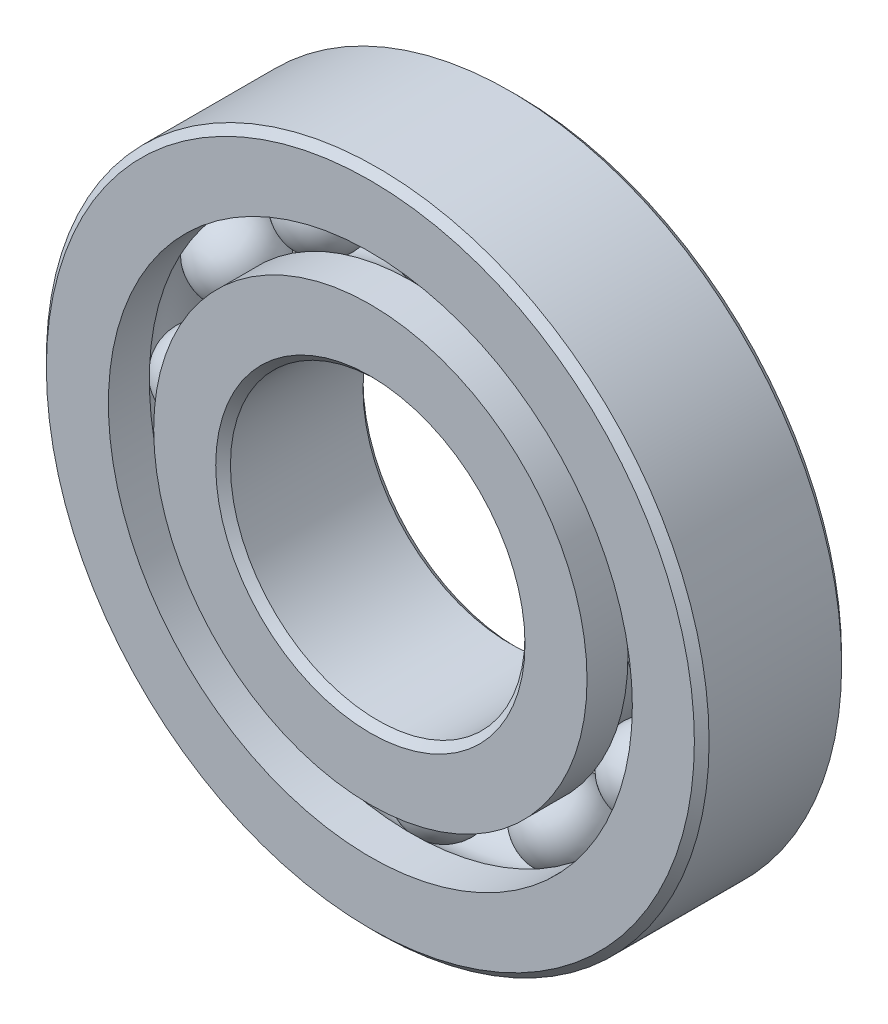
ISO-10303-21;
HEADER;
FILE_DESCRIPTION(('STEP AP214'),'2;1');
FILE_NAME('part.step','',(''),(''),'','','');
FILE_SCHEMA(('AUTOMOTIVE_DESIGN { 1 0 10303 214 1 1 1 1 }'));
ENDSEC;
DATA;
#1=APPLICATION_CONTEXT('core data for automotive mechanical design processes');
#2=APPLICATION_PROTOCOL_DEFINITION('international standard','automotive_design',2000,#1);
#3=PRODUCT_CONTEXT('',#1,'mechanical');
#4=PRODUCT('Part','Part','',(#3));
#5=PRODUCT_RELATED_PRODUCT_CATEGORY('part','',(#4));
#6=PRODUCT_DEFINITION_FORMATION('','',#4);
#7=PRODUCT_DEFINITION_CONTEXT('part definition',#1,'design');
#8=PRODUCT_DEFINITION('design','',#6,#7);
#9=PRODUCT_DEFINITION_SHAPE('','',#8);
#10=(LENGTH_UNIT() NAMED_UNIT(*) SI_UNIT(.MILLI.,.METRE.));
#11=(NAMED_UNIT(*) PLANE_ANGLE_UNIT() SI_UNIT($,.RADIAN.));
#12=(NAMED_UNIT(*) SI_UNIT($,.STERADIAN.) SOLID_ANGLE_UNIT());
#13=UNCERTAINTY_MEASURE_WITH_UNIT(LENGTH_MEASURE(1.E-05),#10,'distance_accuracy_value','');
#14=(GEOMETRIC_REPRESENTATION_CONTEXT(3) GLOBAL_UNCERTAINTY_ASSIGNED_CONTEXT((#13)) GLOBAL_UNIT_ASSIGNED_CONTEXT((#10,
#11,#12)) REPRESENTATION_CONTEXT('',''));
#15=CARTESIAN_POINT('',(0.,0.,0.));
#16=DIRECTION('',(0.,0.,1.));
#17=DIRECTION('',(1.,0.,0.));
#18=AXIS2_PLACEMENT_3D('',#15,#16,#17);
#19=CARTESIAN_POINT('',(-5.15937499999989,8.93629963530074,0.));
#20=DIRECTION('',(0.,0.,1.));
#21=DIRECTION('',(-0.499999999999989,0.866025403784445,0.));
#22=AXIS2_PLACEMENT_3D('',#19,#20,#21);
#23=SPHERICAL_SURFACE('',#22,1.71627890103156);
#24=CARTESIAN_POINT('',(-5.15937499999989,8.93629963530074,1.71627890103155));
#25=VERTEX_POINT('',#24);
#26=VERTEX_LOOP('',#25);
#27=FACE_BOUND('',#26,.T.);
#28=ADVANCED_FACE('F41',(#27),#23,.T.);
#29=CLOSED_SHELL('',(#28));
#30=MANIFOLD_SOLID_BREP('B2',#29);
#31=CARTESIAN_POINT('',(-8.93629963530062,5.1593750000001,0.));
#32=DIRECTION('',(0.,0.,1.));
#33=DIRECTION('',(-0.866025403784433,0.50000000000001,0.));
#34=AXIS2_PLACEMENT_3D('',#31,#32,#33);
#35=SPHERICAL_SURFACE('',#34,1.71627890103156);
#36=CARTESIAN_POINT('',(-8.93629963530062,5.1593750000001,1.71627890103155));
#37=VERTEX_POINT('',#36);
#38=VERTEX_LOOP('',#37);
#39=FACE_BOUND('',#38,.T.);
#40=ADVANCED_FACE('F61',(#39),#35,.T.);
#41=CLOSED_SHELL('',(#40));
#42=MANIFOLD_SOLID_BREP('B6',#41);
#43=CARTESIAN_POINT('',(-10.31875,1.08083231797342E-13,0.));
#44=DIRECTION('',(0.,0.,1.));
#45=DIRECTION('',(-1.,0.,0.));
#46=AXIS2_PLACEMENT_3D('',#43,#44,#45);
#47=SPHERICAL_SURFACE('',#46,1.71627890103156);
#48=CARTESIAN_POINT('',(-10.31875,1.08083231797342E-13,1.71627890103155));
#49=VERTEX_POINT('',#48);
#50=VERTEX_LOOP('',#49);
#51=FACE_BOUND('',#50,.T.);
#52=ADVANCED_FACE('F81',(#51),#47,.T.);
#53=CLOSED_SHELL('',(#52));
#54=MANIFOLD_SOLID_BREP('B37',#53);
#55=CARTESIAN_POINT('',(-8.93629963530072,-5.15937499999992,0.));
#56=DIRECTION('',(0.,0.,1.));
#57=DIRECTION('',(-0.866025403784443,-0.499999999999992,0.));
#58=AXIS2_PLACEMENT_3D('',#55,#56,#57);
#59=SPHERICAL_SURFACE('',#58,1.71627890103156);
#60=CARTESIAN_POINT('',(-8.93629963530072,-5.15937499999992,1.71627890103155));
#61=VERTEX_POINT('',#60);
#62=VERTEX_LOOP('',#61);
#63=FACE_BOUND('',#62,.T.);
#64=ADVANCED_FACE('F101',(#63),#59,.T.);
#65=CLOSED_SHELL('',(#64));
#66=MANIFOLD_SOLID_BREP('B57',#65);
#67=CARTESIAN_POINT('',(-5.15937500000007,-8.93629963530064,0.));
#68=DIRECTION('',(0.,0.,1.));
#69=DIRECTION('',(-0.500000000000007,-0.866025403784435,0.));
#70=AXIS2_PLACEMENT_3D('',#67,#68,#69);
#71=SPHERICAL_SURFACE('',#70,1.71627890103156);
#72=CARTESIAN_POINT('',(-5.15937500000007,-8.93629963530064,1.71627890103155));
#73=VERTEX_POINT('',#72);
#74=VERTEX_LOOP('',#73);
#75=FACE_BOUND('',#74,.T.);
#76=ADVANCED_FACE('F121',(#75),#71,.T.);
#77=CLOSED_SHELL('',(#76));
#78=MANIFOLD_SOLID_BREP('B77',#77);
#79=CARTESIAN_POINT('',(0.,-10.31875,0.));
#80=DIRECTION('',(0.,0.,1.));
#81=DIRECTION('',(0.,-1.,0.));
#82=AXIS2_PLACEMENT_3D('',#79,#80,#81);
#83=SPHERICAL_SURFACE('',#82,1.71627890103156);
#84=CARTESIAN_POINT('',(0.,-10.31875,1.71627890103155));
#85=VERTEX_POINT('',#84);
#86=VERTEX_LOOP('',#85);
#87=FACE_BOUND('',#86,.T.);
#88=ADVANCED_FACE('F141',(#87),#83,.T.);
#89=CLOSED_SHELL('',(#88));
#90=MANIFOLD_SOLID_BREP('B97',#89);
#91=CARTESIAN_POINT('',(5.15937499999995,-8.93629963530071,0.));
#92=DIRECTION('',(0.,0.,1.));
#93=DIRECTION('',(0.499999999999995,-0.866025403784442,0.));
#94=AXIS2_PLACEMENT_3D('',#91,#92,#93);
#95=SPHERICAL_SURFACE('',#94,1.71627890103156);
#96=CARTESIAN_POINT('',(5.15937499999995,-8.93629963530071,1.71627890103155));
#97=VERTEX_POINT('',#96);
#98=VERTEX_LOOP('',#97);
#99=FACE_BOUND('',#98,.T.);
#100=ADVANCED_FACE('F161',(#99),#95,.T.);
#101=CLOSED_SHELL('',(#100));
#102=MANIFOLD_SOLID_BREP('B117',#101);
#103=CARTESIAN_POINT('',(8.93629963530065,-5.15937500000004,0.));
#104=DIRECTION('',(0.,0.,1.));
#105=DIRECTION('',(0.866025403784436,-0.500000000000004,0.));
#106=AXIS2_PLACEMENT_3D('',#103,#104,#105);
#107=SPHERICAL_SURFACE('',#106,1.71627890103156);
#108=CARTESIAN_POINT('',(8.93629963530065,-5.15937500000004,1.71627890103155));
#109=VERTEX_POINT('',#108);
#110=VERTEX_LOOP('',#109);
#111=FACE_BOUND('',#110,.T.);
#112=ADVANCED_FACE('F181',(#111),#107,.T.);
#113=CLOSED_SHELL('',(#112));
#114=MANIFOLD_SOLID_BREP('B137',#113);
#115=CARTESIAN_POINT('',(10.31875,0.,0.));
#116=DIRECTION('',(0.,0.,1.));
#117=DIRECTION('',(1.,0.,0.));
#118=AXIS2_PLACEMENT_3D('',#115,#116,#117);
#119=SPHERICAL_SURFACE('',#118,1.71627890103156);
#120=CARTESIAN_POINT('',(10.31875,0.,1.71627890103155));
#121=VERTEX_POINT('',#120);
#122=VERTEX_LOOP('',#121);
#123=FACE_BOUND('',#122,.T.);
#124=ADVANCED_FACE('F201',(#123),#119,.T.);
#125=CLOSED_SHELL('',(#124));
#126=MANIFOLD_SOLID_BREP('B157',#125);
#127=CARTESIAN_POINT('',(8.93629963530069,5.15937499999998,0.));
#128=DIRECTION('',(0.,0.,1.));
#129=DIRECTION('',(0.86602540378444,0.499999999999998,0.));
#130=AXIS2_PLACEMENT_3D('',#127,#128,#129);
#131=SPHERICAL_SURFACE('',#130,1.71627890103156);
#132=CARTESIAN_POINT('',(8.93629963530069,5.15937499999998,1.71627890103155));
#133=VERTEX_POINT('',#132);
#134=VERTEX_LOOP('',#133);
#135=FACE_BOUND('',#134,.T.);
#136=ADVANCED_FACE('F221',(#135),#131,.T.);
#137=CLOSED_SHELL('',(#136));
#138=MANIFOLD_SOLID_BREP('B177',#137);
#139=CARTESIAN_POINT('',(5.15937500000001,8.93629963530067,0.));
#140=DIRECTION('',(0.,0.,1.));
#141=DIRECTION('',(0.500000000000001,0.866025403784438,0.));
#142=AXIS2_PLACEMENT_3D('',#139,#140,#141);
#143=SPHERICAL_SURFACE('',#142,1.71627890103156);
#144=CARTESIAN_POINT('',(5.15937500000001,8.93629963530067,1.71627890103155));
#145=VERTEX_POINT('',#144);
#146=VERTEX_LOOP('',#145);
#147=FACE_BOUND('',#146,.T.);
#148=ADVANCED_FACE('F241',(#147),#143,.T.);
#149=CLOSED_SHELL('',(#148));
#150=MANIFOLD_SOLID_BREP('B197',#149);
#151=CARTESIAN_POINT('',(0.,10.31875,0.));
#152=DIRECTION('',(0.,0.,1.));
#153=DIRECTION('',(0.,1.,0.));
#154=AXIS2_PLACEMENT_3D('',#151,#152,#153);
#155=SPHERICAL_SURFACE('',#154,1.71627890103156);
#156=CARTESIAN_POINT('',(0.,10.31875,1.71627890103155));
#157=VERTEX_POINT('',#156);
#158=VERTEX_LOOP('',#157);
#159=FACE_BOUND('',#158,.T.);
#160=ADVANCED_FACE('F263',(#159),#155,.T.);
#161=CLOSED_SHELL('',(#160));
#162=MANIFOLD_SOLID_BREP('B217',#161);
#163=CARTESIAN_POINT('',(0.,9.34182692307692,3.175));
#164=DIRECTION('',(0.,0.,-1.));
#165=DIRECTION('',(-1.,0.,0.));
#166=AXIS2_PLACEMENT_3D('',#163,#164,#165);
#167=PLANE('',#166);
#168=CARTESIAN_POINT('',(0.,0.,3.175));
#169=DIRECTION('',(0.,0.,1.));
#170=DIRECTION('',(1.,0.,0.));
#171=AXIS2_PLACEMENT_3D('',#168,#169,#170);
#172=CIRCLE('',#171,6.6675);
#173=CARTESIAN_POINT('',(6.6675,0.,3.175));
#174=VERTEX_POINT('',#173);
#175=EDGE_CURVE('E310',#174,#174,#172,.T.);
#176=ORIENTED_EDGE('',*,*,#175,.F.);
#177=EDGE_LOOP('',(#176));
#178=FACE_BOUND('',#177,.T.);
#179=CARTESIAN_POINT('',(0.,0.,3.175));
#180=DIRECTION('',(0.,0.,1.));
#181=DIRECTION('',(1.,0.,0.));
#182=AXIS2_PLACEMENT_3D('',#179,#180,#181);
#183=CIRCLE('',#182,9.34182692307692);
#184=CARTESIAN_POINT('',(9.34182692307692,0.,3.175));
#185=VERTEX_POINT('',#184);
#186=EDGE_CURVE('E262',#185,#185,#183,.T.);
#187=ORIENTED_EDGE('',*,*,#186,.T.);
#188=EDGE_LOOP('',(#187));
#189=FACE_BOUND('',#188,.T.);
#190=ADVANCED_FACE('F282',(#178,#189),#167,.F.);
#191=CARTESIAN_POINT('',(0.,0.,3.175));
#192=DIRECTION('',(0.,0.,1.));
#193=DIRECTION('',(1.,0.,0.));
#194=AXIS2_PLACEMENT_3D('',#191,#192,#193);
#195=CYLINDRICAL_SURFACE('',#194,9.34182692307692);
#196=ORIENTED_EDGE('',*,*,#186,.F.);
#197=EDGE_LOOP('',(#196));
#198=FACE_BOUND('',#197,.T.);
#199=CARTESIAN_POINT('',(0.,0.,1.41111111111111));
#200=DIRECTION('',(0.,0.,1.));
#201=DIRECTION('',(1.,0.,0.));
#202=AXIS2_PLACEMENT_3D('',#199,#200,#201);
#203=CIRCLE('',#202,9.34182692307692);
#204=CARTESIAN_POINT('',(9.34182692307692,0.,1.41111111111111));
#205=VERTEX_POINT('',#204);
#206=EDGE_CURVE('E288',#205,#205,#203,.T.);
#207=ORIENTED_EDGE('',*,*,#206,.T.);
#208=EDGE_LOOP('',(#207));
#209=FACE_BOUND('',#208,.T.);
#210=ADVANCED_FACE('F317',(#198,#209),#195,.T.);
#211=CARTESIAN_POINT('',(0.,0.,0.));
#212=DIRECTION('',(0.,0.,1.));
#213=DIRECTION('',(1.,0.,0.));
#214=AXIS2_PLACEMENT_3D('',#211,#212,#213);
#215=TOROIDAL_SURFACE('',#214,10.31875,1.71627890103155);
#216=ORIENTED_EDGE('',*,*,#206,.F.);
#217=EDGE_LOOP('',(#216));
#218=FACE_BOUND('',#217,.T.);
#219=CARTESIAN_POINT('',(0.,0.,-1.41111111111111));
#220=DIRECTION('',(0.,0.,1.));
#221=DIRECTION('',(1.,0.,0.));
#222=AXIS2_PLACEMENT_3D('',#219,#220,#221);
#223=CIRCLE('',#222,9.34182692307692);
#224=CARTESIAN_POINT('',(9.34182692307692,0.,-1.41111111111111));
#225=VERTEX_POINT('',#224);
#226=EDGE_CURVE('E292',#225,#225,#223,.T.);
#227=ORIENTED_EDGE('',*,*,#226,.T.);
#228=EDGE_LOOP('',(#227));
#229=FACE_BOUND('',#228,.T.);
#230=ADVANCED_FACE('F321',(#218,#229),#215,.F.);
#231=CARTESIAN_POINT('',(0.,0.,3.175));
#232=DIRECTION('',(0.,0.,1.));
#233=DIRECTION('',(1.,0.,0.));
#234=AXIS2_PLACEMENT_3D('',#231,#232,#233);
#235=CYLINDRICAL_SURFACE('',#234,9.34182692307692);
#236=ORIENTED_EDGE('',*,*,#226,.F.);
#237=EDGE_LOOP('',(#236));
#238=FACE_BOUND('',#237,.T.);
#239=CARTESIAN_POINT('',(0.,0.,-3.175));
#240=DIRECTION('',(0.,0.,1.));
#241=DIRECTION('',(1.,0.,0.));
#242=AXIS2_PLACEMENT_3D('',#239,#240,#241);
#243=CIRCLE('',#242,9.34182692307692);
#244=CARTESIAN_POINT('',(9.34182692307692,0.,-3.175));
#245=VERTEX_POINT('',#244);
#246=EDGE_CURVE('E296',#245,#245,#243,.T.);
#247=ORIENTED_EDGE('',*,*,#246,.T.);
#248=EDGE_LOOP('',(#247));
#249=FACE_BOUND('',#248,.T.);
#250=ADVANCED_FACE('F326',(#238,#249),#235,.T.);
#251=CARTESIAN_POINT('',(0.,6.6675,-3.175));
#252=DIRECTION('',(0.,0.,1.));
#253=DIRECTION('',(1.,0.,0.));
#254=AXIS2_PLACEMENT_3D('',#251,#252,#253);
#255=PLANE('',#254);
#256=ORIENTED_EDGE('',*,*,#246,.F.);
#257=EDGE_LOOP('',(#256));
#258=FACE_BOUND('',#257,.T.);
#259=CARTESIAN_POINT('',(0.,0.,-3.175));
#260=DIRECTION('',(0.,0.,1.));
#261=DIRECTION('',(1.,0.,0.));
#262=AXIS2_PLACEMENT_3D('',#259,#260,#261);
#263=CIRCLE('',#262,6.6675);
#264=CARTESIAN_POINT('',(6.6675,0.,-3.175));
#265=VERTEX_POINT('',#264);
#266=EDGE_CURVE('E301',#265,#265,#263,.T.);
#267=ORIENTED_EDGE('',*,*,#266,.T.);
#268=EDGE_LOOP('',(#267));
#269=FACE_BOUND('',#268,.T.);
#270=ADVANCED_FACE('F332',(#258,#269),#255,.F.);
#271=CARTESIAN_POINT('',(0.,0.,-2.8575));
#272=DIRECTION('',(0.,0.,-1.));
#273=DIRECTION('',(-1.,0.,0.));
#274=AXIS2_PLACEMENT_3D('',#271,#272,#273);
#275=CONICAL_SURFACE('',#274,6.35,0.785398163397452);
#276=ORIENTED_EDGE('',*,*,#266,.F.);
#277=EDGE_LOOP('',(#276));
#278=FACE_BOUND('',#277,.T.);
#279=CARTESIAN_POINT('',(0.,0.,-2.8575));
#280=DIRECTION('',(0.,0.,1.));
#281=DIRECTION('',(1.,0.,0.));
#282=AXIS2_PLACEMENT_3D('',#279,#280,#281);
#283=CIRCLE('',#282,6.35);
#284=CARTESIAN_POINT('',(6.35,0.,-2.8575));
#285=VERTEX_POINT('',#284);
#286=EDGE_CURVE('E304',#285,#285,#283,.T.);
#287=ORIENTED_EDGE('',*,*,#286,.T.);
#288=EDGE_LOOP('',(#287));
#289=FACE_BOUND('',#288,.T.);
#290=ADVANCED_FACE('F336',(#278,#289),#275,.F.);
#291=CARTESIAN_POINT('',(0.,0.,3.175));
#292=DIRECTION('',(0.,0.,1.));
#293=DIRECTION('',(1.,0.,0.));
#294=AXIS2_PLACEMENT_3D('',#291,#292,#293);
#295=CYLINDRICAL_SURFACE('',#294,6.35);
#296=ORIENTED_EDGE('',*,*,#286,.F.);
#297=EDGE_LOOP('',(#296));
#298=FACE_BOUND('',#297,.T.);
#299=CARTESIAN_POINT('',(0.,0.,2.8575));
#300=DIRECTION('',(0.,0.,1.));
#301=DIRECTION('',(1.,0.,0.));
#302=AXIS2_PLACEMENT_3D('',#299,#300,#301);
#303=CIRCLE('',#302,6.35);
#304=CARTESIAN_POINT('',(6.35,0.,2.8575));
#305=VERTEX_POINT('',#304);
#306=EDGE_CURVE('E307',#305,#305,#303,.T.);
#307=ORIENTED_EDGE('',*,*,#306,.T.);
#308=EDGE_LOOP('',(#307));
#309=FACE_BOUND('',#308,.T.);
#310=ADVANCED_FACE('F340',(#298,#309),#295,.F.);
#311=CARTESIAN_POINT('',(0.,0.,3.175));
#312=DIRECTION('',(0.,0.,1.));
#313=DIRECTION('',(1.,0.,0.));
#314=AXIS2_PLACEMENT_3D('',#311,#312,#313);
#315=CONICAL_SURFACE('',#314,6.6675,0.785398163397444);
#316=ORIENTED_EDGE('',*,*,#306,.F.);
#317=EDGE_LOOP('',(#316));
#318=FACE_BOUND('',#317,.T.);
#319=ORIENTED_EDGE('',*,*,#175,.T.);
#320=EDGE_LOOP('',(#319));
#321=FACE_BOUND('',#320,.T.);
#322=ADVANCED_FACE('F314',(#318,#321),#315,.F.);
#323=CLOSED_SHELL('',(#190,#210,#230,#250,#270,#290,#310,#322));
#324=MANIFOLD_SOLID_BREP('B237',#323);
#325=CARTESIAN_POINT('',(0.,0.,2.8575));
#326=DIRECTION('',(0.,0.,-1.));
#327=DIRECTION('',(-1.,0.,0.));
#328=AXIS2_PLACEMENT_3D('',#325,#326,#327);
#329=CONICAL_SURFACE('',#328,14.2875,0.785398163397448);
#330=CARTESIAN_POINT('',(0.,0.,3.175));
#331=DIRECTION('',(0.,0.,1.));
#332=DIRECTION('',(1.,0.,0.));
#333=AXIS2_PLACEMENT_3D('',#330,#331,#332);
#334=CIRCLE('',#333,13.97);
#335=CARTESIAN_POINT('',(13.97,0.,3.175));
#336=VERTEX_POINT('',#335);
#337=EDGE_CURVE('E431',#336,#336,#334,.T.);
#338=ORIENTED_EDGE('',*,*,#337,.F.);
#339=EDGE_LOOP('',(#338));
#340=FACE_BOUND('',#339,.T.);
#341=CARTESIAN_POINT('',(0.,0.,2.8575));
#342=DIRECTION('',(0.,0.,1.));
#343=DIRECTION('',(1.,0.,0.));
#344=AXIS2_PLACEMENT_3D('',#341,#342,#343);
#345=CIRCLE('',#344,14.2875);
#346=CARTESIAN_POINT('',(14.2875,0.,2.8575));
#347=VERTEX_POINT('',#346);
#348=EDGE_CURVE('E281',#347,#347,#345,.T.);
#349=ORIENTED_EDGE('',*,*,#348,.T.);
#350=EDGE_LOOP('',(#349));
#351=FACE_BOUND('',#350,.T.);
#352=ADVANCED_FACE('F403',(#340,#351),#329,.T.);
#353=CARTESIAN_POINT('',(0.,0.,3.175));
#354=DIRECTION('',(0.,0.,1.));
#355=DIRECTION('',(1.,0.,0.));
#356=AXIS2_PLACEMENT_3D('',#353,#354,#355);
#357=CYLINDRICAL_SURFACE('',#356,14.2875);
#358=ORIENTED_EDGE('',*,*,#348,.F.);
#359=EDGE_LOOP('',(#358));
#360=FACE_BOUND('',#359,.T.);
#361=CARTESIAN_POINT('',(0.,0.,-2.8575));
#362=DIRECTION('',(0.,0.,1.));
#363=DIRECTION('',(1.,0.,0.));
#364=AXIS2_PLACEMENT_3D('',#361,#362,#363);
#365=CIRCLE('',#364,14.2875);
#366=CARTESIAN_POINT('',(14.2875,0.,-2.8575));
#367=VERTEX_POINT('',#366);
#368=EDGE_CURVE('E409',#367,#367,#365,.T.);
#369=ORIENTED_EDGE('',*,*,#368,.T.);
#370=EDGE_LOOP('',(#369));
#371=FACE_BOUND('',#370,.T.);
#372=ADVANCED_FACE('F438',(#360,#371),#357,.T.);
#373=CARTESIAN_POINT('',(0.,0.,-3.175));
#374=DIRECTION('',(0.,0.,1.));
#375=DIRECTION('',(1.,0.,0.));
#376=AXIS2_PLACEMENT_3D('',#373,#374,#375);
#377=CONICAL_SURFACE('',#376,13.97,0.785398163397448);
#378=ORIENTED_EDGE('',*,*,#368,.F.);
#379=EDGE_LOOP('',(#378));
#380=FACE_BOUND('',#379,.T.);
#381=CARTESIAN_POINT('',(0.,0.,-3.175));
#382=DIRECTION('',(0.,0.,1.));
#383=DIRECTION('',(1.,0.,0.));
#384=AXIS2_PLACEMENT_3D('',#381,#382,#383);
#385=CIRCLE('',#384,13.97);
#386=CARTESIAN_POINT('',(13.97,0.,-3.175));
#387=VERTEX_POINT('',#386);
#388=EDGE_CURVE('E413',#387,#387,#385,.T.);
#389=ORIENTED_EDGE('',*,*,#388,.T.);
#390=EDGE_LOOP('',(#389));
#391=FACE_BOUND('',#390,.T.);
#392=ADVANCED_FACE('F442',(#380,#391),#377,.T.);
#393=CARTESIAN_POINT('',(0.,13.97,-3.175));
#394=DIRECTION('',(0.,0.,1.));
#395=DIRECTION('',(1.,0.,0.));
#396=AXIS2_PLACEMENT_3D('',#393,#394,#395);
#397=PLANE('',#396);
#398=ORIENTED_EDGE('',*,*,#388,.F.);
#399=EDGE_LOOP('',(#398));
#400=FACE_BOUND('',#399,.T.);
#401=CARTESIAN_POINT('',(0.,0.,-3.175));
#402=DIRECTION('',(0.,0.,1.));
#403=DIRECTION('',(1.,0.,0.));
#404=AXIS2_PLACEMENT_3D('',#401,#402,#403);
#405=CIRCLE('',#404,11.2956730769231);
#406=CARTESIAN_POINT('',(11.2956730769231,0.,-3.175));
#407=VERTEX_POINT('',#406);
#408=EDGE_CURVE('E417',#407,#407,#405,.T.);
#409=ORIENTED_EDGE('',*,*,#408,.T.);
#410=EDGE_LOOP('',(#409));
#411=FACE_BOUND('',#410,.T.);
#412=ADVANCED_FACE('F447',(#400,#411),#397,.F.);
#413=CARTESIAN_POINT('',(0.,0.,3.175));
#414=DIRECTION('',(0.,0.,1.));
#415=DIRECTION('',(1.,0.,0.));
#416=AXIS2_PLACEMENT_3D('',#413,#414,#415);
#417=CYLINDRICAL_SURFACE('',#416,11.2956730769231);
#418=ORIENTED_EDGE('',*,*,#408,.F.);
#419=EDGE_LOOP('',(#418));
#420=FACE_BOUND('',#419,.T.);
#421=CARTESIAN_POINT('',(0.,0.,-1.41111111111111));
#422=DIRECTION('',(0.,0.,1.));
#423=DIRECTION('',(1.,0.,0.));
#424=AXIS2_PLACEMENT_3D('',#421,#422,#423);
#425=CIRCLE('',#424,11.2956730769231);
#426=CARTESIAN_POINT('',(11.2956730769231,0.,-1.41111111111111));
#427=VERTEX_POINT('',#426);
#428=EDGE_CURVE('E422',#427,#427,#425,.T.);
#429=ORIENTED_EDGE('',*,*,#428,.T.);
#430=EDGE_LOOP('',(#429));
#431=FACE_BOUND('',#430,.T.);
#432=ADVANCED_FACE('F453',(#420,#431),#417,.F.);
#433=CARTESIAN_POINT('',(0.,0.,0.));
#434=DIRECTION('',(0.,0.,1.));
#435=DIRECTION('',(1.,0.,0.));
#436=AXIS2_PLACEMENT_3D('',#433,#434,#435);
#437=TOROIDAL_SURFACE('',#436,10.31875,1.71627890103156);
#438=ORIENTED_EDGE('',*,*,#428,.F.);
#439=EDGE_LOOP('',(#438));
#440=FACE_BOUND('',#439,.T.);
#441=CARTESIAN_POINT('',(0.,0.,1.41111111111111));
#442=DIRECTION('',(0.,0.,1.));
#443=DIRECTION('',(1.,0.,0.));
#444=AXIS2_PLACEMENT_3D('',#441,#442,#443);
#445=CIRCLE('',#444,11.2956730769231);
#446=CARTESIAN_POINT('',(11.2956730769231,0.,1.41111111111111));
#447=VERTEX_POINT('',#446);
#448=EDGE_CURVE('E425',#447,#447,#445,.T.);
#449=ORIENTED_EDGE('',*,*,#448,.T.);
#450=EDGE_LOOP('',(#449));
#451=FACE_BOUND('',#450,.T.);
#452=ADVANCED_FACE('F457',(#440,#451),#437,.F.);
#453=CARTESIAN_POINT('',(0.,0.,3.175));
#454=DIRECTION('',(0.,0.,1.));
#455=DIRECTION('',(1.,0.,0.));
#456=AXIS2_PLACEMENT_3D('',#453,#454,#455);
#457=CYLINDRICAL_SURFACE('',#456,11.2956730769231);
#458=ORIENTED_EDGE('',*,*,#448,.F.);
#459=EDGE_LOOP('',(#458));
#460=FACE_BOUND('',#459,.T.);
#461=CARTESIAN_POINT('',(0.,0.,3.175));
#462=DIRECTION('',(0.,0.,1.));
#463=DIRECTION('',(1.,0.,0.));
#464=AXIS2_PLACEMENT_3D('',#461,#462,#463);
#465=CIRCLE('',#464,11.2956730769231);
#466=CARTESIAN_POINT('',(11.2956730769231,0.,3.175));
#467=VERTEX_POINT('',#466);
#468=EDGE_CURVE('E428',#467,#467,#465,.T.);
#469=ORIENTED_EDGE('',*,*,#468,.T.);
#470=EDGE_LOOP('',(#469));
#471=FACE_BOUND('',#470,.T.);
#472=ADVANCED_FACE('F461',(#460,#471),#457,.F.);
#473=CARTESIAN_POINT('',(0.,13.97,3.175));
#474=DIRECTION('',(0.,0.,-1.));
#475=DIRECTION('',(-1.,0.,0.));
#476=AXIS2_PLACEMENT_3D('',#473,#474,#475);
#477=PLANE('',#476);
#478=ORIENTED_EDGE('',*,*,#468,.F.);
#479=EDGE_LOOP('',(#478));
#480=FACE_BOUND('',#479,.T.);
#481=ORIENTED_EDGE('',*,*,#337,.T.);
#482=EDGE_LOOP('',(#481));
#483=FACE_BOUND('',#482,.T.);
#484=ADVANCED_FACE('F435',(#480,#483),#477,.F.);
#485=CLOSED_SHELL('',(#352,#372,#392,#412,#432,#452,#472,#484));
#486=MANIFOLD_SOLID_BREP('B257',#485);
#487=ADVANCED_BREP_SHAPE_REPRESENTATION('',(#18,#30,#42,#54,#66,#78,#90,#102,#114,#126,#138,
#150,#162,#324,#486),#14);
#488=SHAPE_DEFINITION_REPRESENTATION(#9,#487);
ENDSEC;
END-ISO-10303-21;
